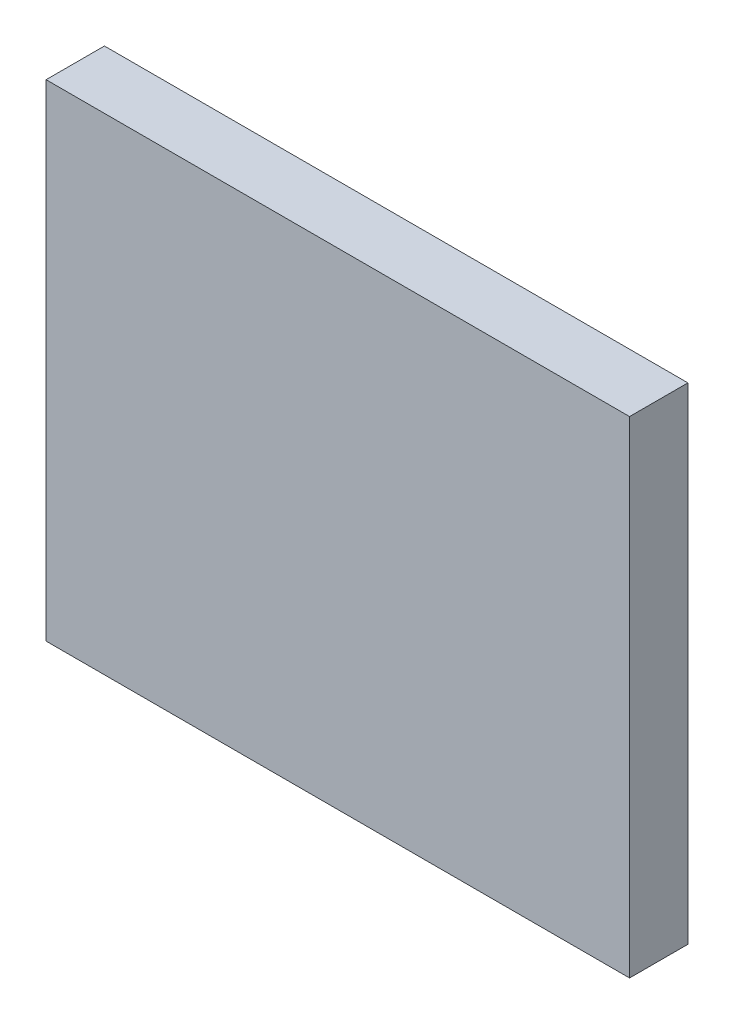
ISO-10303-21;
HEADER;
FILE_DESCRIPTION(('STEP AP214'),'2;1');
FILE_NAME('part.step','',(''),(''),'','','');
FILE_SCHEMA(('AUTOMOTIVE_DESIGN { 1 0 10303 214 1 1 1 1 }'));
ENDSEC;
DATA;
#1=APPLICATION_CONTEXT('core data for automotive mechanical design processes');
#2=APPLICATION_PROTOCOL_DEFINITION('international standard','automotive_design',2000,#1);
#3=PRODUCT_CONTEXT('',#1,'mechanical');
#4=PRODUCT('Part','Part','',(#3));
#5=PRODUCT_RELATED_PRODUCT_CATEGORY('part','',(#4));
#6=PRODUCT_DEFINITION_FORMATION('','',#4);
#7=PRODUCT_DEFINITION_CONTEXT('part definition',#1,'design');
#8=PRODUCT_DEFINITION('design','',#6,#7);
#9=PRODUCT_DEFINITION_SHAPE('','',#8);
#10=(LENGTH_UNIT() NAMED_UNIT(*) SI_UNIT(.MILLI.,.METRE.));
#11=(NAMED_UNIT(*) PLANE_ANGLE_UNIT() SI_UNIT($,.RADIAN.));
#12=(NAMED_UNIT(*) SI_UNIT($,.STERADIAN.) SOLID_ANGLE_UNIT());
#13=UNCERTAINTY_MEASURE_WITH_UNIT(LENGTH_MEASURE(1.E-05),#10,'distance_accuracy_value','');
#14=(GEOMETRIC_REPRESENTATION_CONTEXT(3) GLOBAL_UNCERTAINTY_ASSIGNED_CONTEXT((#13)) GLOBAL_UNIT_ASSIGNED_CONTEXT((#10,
#11,#12)) REPRESENTATION_CONTEXT('',''));
#15=CARTESIAN_POINT('',(0.,0.,0.));
#16=DIRECTION('',(0.,0.,1.));
#17=DIRECTION('',(1.,0.,0.));
#18=AXIS2_PLACEMENT_3D('',#15,#16,#17);
#19=CARTESIAN_POINT('',(15.,12.5,3.));
#20=DIRECTION('',(-1.,0.,0.));
#21=DIRECTION('',(0.,-1.,0.));
#22=AXIS2_PLACEMENT_3D('',#19,#20,#21);
#23=PLANE('',#22);
#24=DIRECTION('',(0.,1.,0.));
#25=VECTOR('',#24,1.);
#26=CARTESIAN_POINT('',(15.,12.5,0.));
#27=LINE('',#26,#25);
#28=CARTESIAN_POINT('',(15.,-12.5,0.));
#29=VERTEX_POINT('',#28);
#30=CARTESIAN_POINT('',(15.,12.5,0.));
#31=VERTEX_POINT('',#30);
#32=EDGE_CURVE('E96',#29,#31,#27,.T.);
#33=ORIENTED_EDGE('',*,*,#32,.T.);
#34=DIRECTION('',(0.,0.,-1.));
#35=VECTOR('',#34,1.);
#36=CARTESIAN_POINT('',(15.,12.5,3.));
#37=LINE('',#36,#35);
#38=CARTESIAN_POINT('',(15.,12.5,3.));
#39=VERTEX_POINT('',#38);
#40=EDGE_CURVE('E11',#39,#31,#37,.T.);
#41=ORIENTED_EDGE('',*,*,#40,.F.);
#42=DIRECTION('',(0.,1.,0.));
#43=VECTOR('',#42,1.);
#44=CARTESIAN_POINT('',(15.,12.5,3.));
#45=LINE('',#44,#43);
#46=CARTESIAN_POINT('',(15.,-12.5,3.));
#47=VERTEX_POINT('',#46);
#48=EDGE_CURVE('E84',#47,#39,#45,.T.);
#49=ORIENTED_EDGE('',*,*,#48,.F.);
#50=DIRECTION('',(0.,0.,-1.));
#51=VECTOR('',#50,1.);
#52=CARTESIAN_POINT('',(15.,-12.5,3.));
#53=LINE('',#52,#51);
#54=EDGE_CURVE('E92',#47,#29,#53,.T.);
#55=ORIENTED_EDGE('',*,*,#54,.T.);
#56=EDGE_LOOP('',(#33,#41,#49,#55));
#57=FACE_BOUND('',#56,.T.);
#58=ADVANCED_FACE('F33',(#57),#23,.F.);
#59=CARTESIAN_POINT('',(-15.,12.5,3.));
#60=DIRECTION('',(0.,-1.,0.));
#61=DIRECTION('',(0.,0.,-1.));
#62=AXIS2_PLACEMENT_3D('',#59,#60,#61);
#63=PLANE('',#62);
#64=DIRECTION('',(-1.,0.,0.));
#65=VECTOR('',#64,1.);
#66=CARTESIAN_POINT('',(-15.,12.5,0.));
#67=LINE('',#66,#65);
#68=CARTESIAN_POINT('',(-15.,12.5,0.));
#69=VERTEX_POINT('',#68);
#70=EDGE_CURVE('E88',#31,#69,#67,.T.);
#71=ORIENTED_EDGE('',*,*,#70,.T.);
#72=DIRECTION('',(0.,0.,-1.));
#73=VECTOR('',#72,1.);
#74=CARTESIAN_POINT('',(-15.,12.5,3.));
#75=LINE('',#74,#73);
#76=CARTESIAN_POINT('',(-15.,12.5,3.));
#77=VERTEX_POINT('',#76);
#78=EDGE_CURVE('E41',#77,#69,#75,.T.);
#79=ORIENTED_EDGE('',*,*,#78,.F.);
#80=DIRECTION('',(-1.,0.,0.));
#81=VECTOR('',#80,1.);
#82=CARTESIAN_POINT('',(-15.,12.5,3.));
#83=LINE('',#82,#81);
#84=EDGE_CURVE('E79',#39,#77,#83,.T.);
#85=ORIENTED_EDGE('',*,*,#84,.F.);
#86=ORIENTED_EDGE('',*,*,#40,.T.);
#87=EDGE_LOOP('',(#71,#79,#85,#86));
#88=FACE_BOUND('',#87,.T.);
#89=ADVANCED_FACE('F87',(#88),#63,.F.);
#90=CARTESIAN_POINT('',(-15.,12.5,3.));
#91=DIRECTION('',(1.,0.,0.));
#92=DIRECTION('',(0.,1.,0.));
#93=AXIS2_PLACEMENT_3D('',#90,#91,#92);
#94=PLANE('',#93);
#95=DIRECTION('',(0.,-1.,0.));
#96=VECTOR('',#95,1.);
#97=CARTESIAN_POINT('',(-15.,12.5,0.));
#98=LINE('',#97,#96);
#99=CARTESIAN_POINT('',(-15.,-12.5,0.));
#100=VERTEX_POINT('',#99);
#101=EDGE_CURVE('E66',#69,#100,#98,.T.);
#102=ORIENTED_EDGE('',*,*,#101,.T.);
#103=DIRECTION('',(0.,0.,-1.));
#104=VECTOR('',#103,1.);
#105=CARTESIAN_POINT('',(-15.,-12.5,3.));
#106=LINE('',#105,#104);
#107=CARTESIAN_POINT('',(-15.,-12.5,3.));
#108=VERTEX_POINT('',#107);
#109=EDGE_CURVE('E89',#108,#100,#106,.T.);
#110=ORIENTED_EDGE('',*,*,#109,.F.);
#111=DIRECTION('',(0.,-1.,0.));
#112=VECTOR('',#111,1.);
#113=CARTESIAN_POINT('',(-15.,12.5,3.));
#114=LINE('',#113,#112);
#115=EDGE_CURVE('E82',#77,#108,#114,.T.);
#116=ORIENTED_EDGE('',*,*,#115,.F.);
#117=ORIENTED_EDGE('',*,*,#78,.T.);
#118=EDGE_LOOP('',(#102,#110,#116,#117));
#119=FACE_BOUND('',#118,.T.);
#120=ADVANCED_FACE('F90',(#119),#94,.F.);
#121=CARTESIAN_POINT('',(-15.,-12.5,3.));
#122=DIRECTION('',(0.,1.,0.));
#123=DIRECTION('',(0.,0.,1.));
#124=AXIS2_PLACEMENT_3D('',#121,#122,#123);
#125=PLANE('',#124);
#126=DIRECTION('',(1.,0.,0.));
#127=VECTOR('',#126,1.);
#128=CARTESIAN_POINT('',(-15.,-12.5,0.));
#129=LINE('',#128,#127);
#130=EDGE_CURVE('E72',#100,#29,#129,.T.);
#131=ORIENTED_EDGE('',*,*,#130,.T.);
#132=ORIENTED_EDGE('',*,*,#54,.F.);
#133=DIRECTION('',(1.,0.,0.));
#134=VECTOR('',#133,1.);
#135=CARTESIAN_POINT('',(-15.,-12.5,3.));
#136=LINE('',#135,#134);
#137=EDGE_CURVE('E49',#108,#47,#136,.T.);
#138=ORIENTED_EDGE('',*,*,#137,.F.);
#139=ORIENTED_EDGE('',*,*,#109,.T.);
#140=EDGE_LOOP('',(#131,#132,#138,#139));
#141=FACE_BOUND('',#140,.T.);
#142=ADVANCED_FACE('F103',(#141),#125,.F.);
#143=CARTESIAN_POINT('',(0.,0.,3.));
#144=DIRECTION('',(0.,0.,1.));
#145=DIRECTION('',(1.,0.,0.));
#146=AXIS2_PLACEMENT_3D('',#143,#144,#145);
#147=PLANE('',#146);
#148=ORIENTED_EDGE('',*,*,#48,.T.);
#149=ORIENTED_EDGE('',*,*,#84,.T.);
#150=ORIENTED_EDGE('',*,*,#115,.T.);
#151=ORIENTED_EDGE('',*,*,#137,.T.);
#152=EDGE_LOOP('',(#148,#149,#150,#151));
#153=FACE_BOUND('',#152,.T.);
#154=ADVANCED_FACE('F80',(#153),#147,.T.);
#155=CARTESIAN_POINT('',(0.,0.,0.));
#156=DIRECTION('',(0.,0.,1.));
#157=DIRECTION('',(1.,0.,0.));
#158=AXIS2_PLACEMENT_3D('',#155,#156,#157);
#159=PLANE('',#158);
#160=ORIENTED_EDGE('',*,*,#32,.F.);
#161=ORIENTED_EDGE('',*,*,#130,.F.);
#162=ORIENTED_EDGE('',*,*,#101,.F.);
#163=ORIENTED_EDGE('',*,*,#70,.F.);
#164=EDGE_LOOP('',(#160,#161,#162,#163));
#165=FACE_BOUND('',#164,.T.);
#166=ADVANCED_FACE('F106',(#165),#159,.F.);
#167=CLOSED_SHELL('',(#58,#89,#120,#142,#154,#166));
#168=MANIFOLD_SOLID_BREP('B2',#167);
#169=ADVANCED_BREP_SHAPE_REPRESENTATION('',(#18,#168),#14);
#170=SHAPE_DEFINITION_REPRESENTATION(#9,#169);
ENDSEC;
END-ISO-10303-21;
